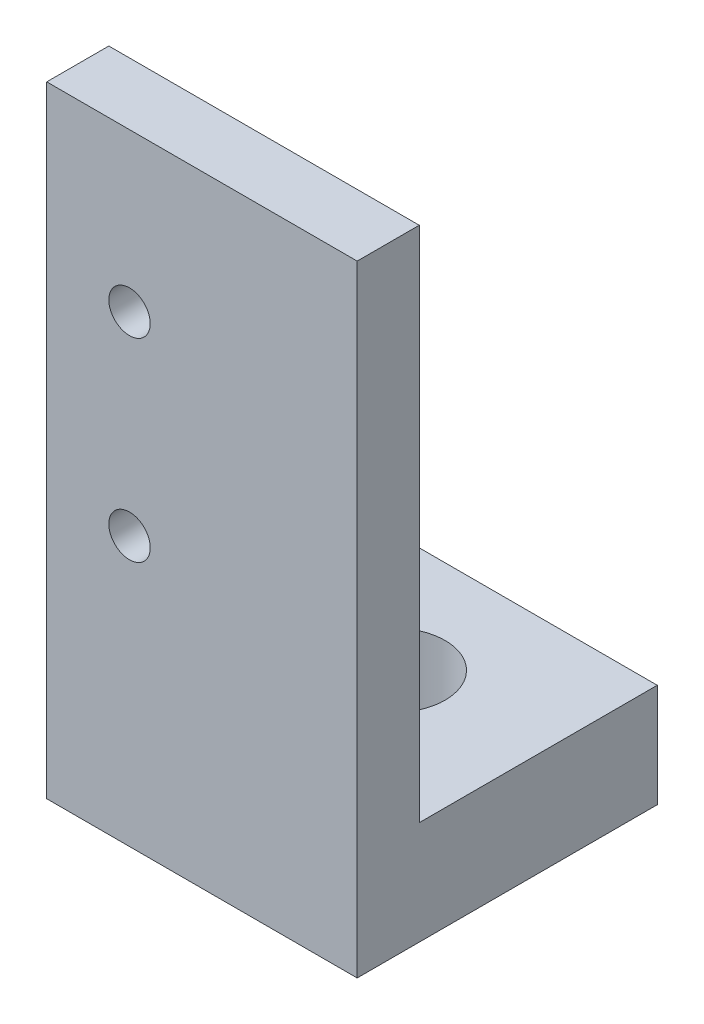
ISO-10303-21;
HEADER;
FILE_DESCRIPTION(('STEP AP214'),'2;1');
FILE_NAME('part.step','',(''),(''),'','','');
FILE_SCHEMA(('AUTOMOTIVE_DESIGN { 1 0 10303 214 1 1 1 1 }'));
ENDSEC;
DATA;
#1=APPLICATION_CONTEXT('core data for automotive mechanical design processes');
#2=APPLICATION_PROTOCOL_DEFINITION('international standard','automotive_design',2000,#1);
#3=PRODUCT_CONTEXT('',#1,'mechanical');
#4=PRODUCT('Part','Part','',(#3));
#5=PRODUCT_RELATED_PRODUCT_CATEGORY('part','',(#4));
#6=PRODUCT_DEFINITION_FORMATION('','',#4);
#7=PRODUCT_DEFINITION_CONTEXT('part definition',#1,'design');
#8=PRODUCT_DEFINITION('design','',#6,#7);
#9=PRODUCT_DEFINITION_SHAPE('','',#8);
#10=(LENGTH_UNIT() NAMED_UNIT(*) SI_UNIT(.MILLI.,.METRE.));
#11=(NAMED_UNIT(*) PLANE_ANGLE_UNIT() SI_UNIT($,.RADIAN.));
#12=(NAMED_UNIT(*) SI_UNIT($,.STERADIAN.) SOLID_ANGLE_UNIT());
#13=UNCERTAINTY_MEASURE_WITH_UNIT(LENGTH_MEASURE(1.E-05),#10,'distance_accuracy_value','');
#14=(GEOMETRIC_REPRESENTATION_CONTEXT(3) GLOBAL_UNCERTAINTY_ASSIGNED_CONTEXT((#13)) GLOBAL_UNIT_ASSIGNED_CONTEXT((#10,
#11,#12)) REPRESENTATION_CONTEXT('',''));
#15=CARTESIAN_POINT('',(0.,0.,0.));
#16=DIRECTION('',(0.,0.,1.));
#17=DIRECTION('',(1.,0.,0.));
#18=AXIS2_PLACEMENT_3D('',#15,#16,#17);
#19=CARTESIAN_POINT('',(0.,5.,-5.75));
#20=DIRECTION('',(0.,0.,-1.));
#21=DIRECTION('',(-1.,0.,0.));
#22=AXIS2_PLACEMENT_3D('',#19,#20,#21);
#23=PLANE('',#22);
#24=DIRECTION('',(0.,1.,0.));
#25=VECTOR('',#24,1.);
#26=CARTESIAN_POINT('',(7.00000000000001,5.,-5.75));
#27=LINE('',#26,#25);
#28=CARTESIAN_POINT('',(7.00000000000001,0.,-5.75));
#29=VERTEX_POINT('',#28);
#30=CARTESIAN_POINT('',(7.00000000000001,5.,-5.75));
#31=VERTEX_POINT('',#30);
#32=EDGE_CURVE('E264',#29,#31,#27,.T.);
#33=ORIENTED_EDGE('',*,*,#32,.F.);
#34=DIRECTION('',(1.,0.,0.));
#35=VECTOR('',#34,1.);
#36=CARTESIAN_POINT('',(0.,0.,-5.75));
#37=LINE('',#36,#35);
#38=CARTESIAN_POINT('',(-8.,0.,-5.75));
#39=VERTEX_POINT('',#38);
#40=EDGE_CURVE('E133',#39,#29,#37,.T.);
#41=ORIENTED_EDGE('',*,*,#40,.F.);
#42=DIRECTION('',(0.,-1.,0.));
#43=VECTOR('',#42,1.);
#44=CARTESIAN_POINT('',(-8.,5.,-5.75));
#45=LINE('',#44,#43);
#46=CARTESIAN_POINT('',(-8.,5.,-5.75));
#47=VERTEX_POINT('',#46);
#48=EDGE_CURVE('E43',#47,#39,#45,.T.);
#49=ORIENTED_EDGE('',*,*,#48,.F.);
#50=DIRECTION('',(1.,0.,0.));
#51=VECTOR('',#50,1.);
#52=CARTESIAN_POINT('',(0.,5.,-5.75));
#53=LINE('',#52,#51);
#54=EDGE_CURVE('E126',#47,#31,#53,.T.);
#55=ORIENTED_EDGE('',*,*,#54,.T.);
#56=EDGE_LOOP('',(#33,#41,#49,#55));
#57=FACE_BOUND('',#56,.T.);
#58=ADVANCED_FACE('F35',(#57),#23,.T.);
#59=CARTESIAN_POINT('',(-8.,5.,0.));
#60=DIRECTION('',(1.,0.,0.));
#61=DIRECTION('',(0.,0.,-1.));
#62=AXIS2_PLACEMENT_3D('',#59,#60,#61);
#63=PLANE('',#62);
#64=DIRECTION('',(0.,0.,1.));
#65=VECTOR('',#64,1.);
#66=CARTESIAN_POINT('',(-8.,0.,0.));
#67=LINE('',#66,#65);
#68=CARTESIAN_POINT('',(-8.,0.,8.75));
#69=VERTEX_POINT('',#68);
#70=EDGE_CURVE('E136',#39,#69,#67,.T.);
#71=ORIENTED_EDGE('',*,*,#70,.T.);
#72=DIRECTION('',(0.,-1.,0.));
#73=VECTOR('',#72,1.);
#74=CARTESIAN_POINT('',(-8.,5.,8.75));
#75=LINE('',#74,#73);
#76=CARTESIAN_POINT('',(-8.,30.,8.75));
#77=VERTEX_POINT('',#76);
#78=EDGE_CURVE('E73',#77,#69,#75,.T.);
#79=ORIENTED_EDGE('',*,*,#78,.F.);
#80=DIRECTION('',(0.,0.,1.));
#81=VECTOR('',#80,1.);
#82=CARTESIAN_POINT('',(-8.,30.,8.75));
#83=LINE('',#82,#81);
#84=CARTESIAN_POINT('',(-8.,30.,5.75));
#85=VERTEX_POINT('',#84);
#86=EDGE_CURVE('E106',#85,#77,#83,.T.);
#87=ORIENTED_EDGE('',*,*,#86,.F.);
#88=DIRECTION('',(0.,-1.,0.));
#89=VECTOR('',#88,1.);
#90=CARTESIAN_POINT('',(-8.,30.,5.75));
#91=LINE('',#90,#89);
#92=CARTESIAN_POINT('',(-8.,5.,5.75));
#93=VERTEX_POINT('',#92);
#94=EDGE_CURVE('E118',#85,#93,#91,.T.);
#95=ORIENTED_EDGE('',*,*,#94,.T.);
#96=DIRECTION('',(0.,0.,1.));
#97=VECTOR('',#96,1.);
#98=CARTESIAN_POINT('',(-8.,5.,0.));
#99=LINE('',#98,#97);
#100=EDGE_CURVE('E128',#47,#93,#99,.T.);
#101=ORIENTED_EDGE('',*,*,#100,.F.);
#102=ORIENTED_EDGE('',*,*,#48,.T.);
#103=EDGE_LOOP('',(#71,#79,#87,#95,#101,#102));
#104=FACE_BOUND('',#103,.T.);
#105=ADVANCED_FACE('F164',(#104),#63,.F.);
#106=CARTESIAN_POINT('',(0.,5.,0.));
#107=DIRECTION('',(0.,-1.,0.));
#108=DIRECTION('',(0.,0.,-1.));
#109=AXIS2_PLACEMENT_3D('',#106,#107,#108);
#110=CYLINDRICAL_SURFACE('',#109,2.5);
#111=CARTESIAN_POINT('',(0.,5.,0.));
#112=DIRECTION('',(0.,1.,0.));
#113=DIRECTION('',(0.,0.,1.));
#114=AXIS2_PLACEMENT_3D('',#111,#112,#113);
#115=CIRCLE('',#114,2.5);
#116=CARTESIAN_POINT('',(0.,5.,2.5));
#117=VERTEX_POINT('',#116);
#118=EDGE_CURVE('E123',#117,#117,#115,.T.);
#119=ORIENTED_EDGE('',*,*,#118,.T.);
#120=EDGE_LOOP('',(#119));
#121=FACE_BOUND('',#120,.T.);
#122=CARTESIAN_POINT('',(0.,0.,0.));
#123=DIRECTION('',(0.,1.,0.));
#124=DIRECTION('',(0.,0.,1.));
#125=AXIS2_PLACEMENT_3D('',#122,#123,#124);
#126=CIRCLE('',#125,2.5);
#127=CARTESIAN_POINT('',(0.,0.,2.5));
#128=VERTEX_POINT('',#127);
#129=EDGE_CURVE('E122',#128,#128,#126,.T.);
#130=ORIENTED_EDGE('',*,*,#129,.F.);
#131=EDGE_LOOP('',(#130));
#132=FACE_BOUND('',#131,.T.);
#133=ADVANCED_FACE('F37',(#121,#132),#110,.F.);
#134=CARTESIAN_POINT('',(0.,5.,8.75));
#135=DIRECTION('',(0.,0.,-1.));
#136=DIRECTION('',(-1.,0.,0.));
#137=AXIS2_PLACEMENT_3D('',#134,#135,#136);
#138=PLANE('',#137);
#139=CARTESIAN_POINT('',(-4.,22.38,8.75));
#140=DIRECTION('',(0.,0.,1.));
#141=DIRECTION('',(1.,0.,0.));
#142=AXIS2_PLACEMENT_3D('',#139,#140,#141);
#143=CIRCLE('',#142,1.);
#144=CARTESIAN_POINT('',(-3.,22.38,8.75));
#145=VERTEX_POINT('',#144);
#146=EDGE_CURVE('E143',#145,#145,#143,.T.);
#147=ORIENTED_EDGE('',*,*,#146,.F.);
#148=EDGE_LOOP('',(#147));
#149=FACE_BOUND('',#148,.T.);
#150=CARTESIAN_POINT('',(-4.,13.,8.75));
#151=DIRECTION('',(0.,0.,1.));
#152=DIRECTION('',(1.,0.,0.));
#153=AXIS2_PLACEMENT_3D('',#150,#151,#152);
#154=CIRCLE('',#153,1.);
#155=CARTESIAN_POINT('',(-3.,13.,8.75));
#156=VERTEX_POINT('',#155);
#157=EDGE_CURVE('E115',#156,#156,#154,.T.);
#158=ORIENTED_EDGE('',*,*,#157,.F.);
#159=EDGE_LOOP('',(#158));
#160=FACE_BOUND('',#159,.T.);
#161=DIRECTION('',(1.,0.,0.));
#162=VECTOR('',#161,1.);
#163=CARTESIAN_POINT('',(0.,0.,8.75));
#164=LINE('',#163,#162);
#165=CARTESIAN_POINT('',(7.00000000000001,0.,8.75));
#166=VERTEX_POINT('',#165);
#167=EDGE_CURVE('E102',#69,#166,#164,.T.);
#168=ORIENTED_EDGE('',*,*,#167,.T.);
#169=DIRECTION('',(0.,-1.,0.));
#170=VECTOR('',#169,1.);
#171=CARTESIAN_POINT('',(7.,30.,8.75));
#172=LINE('',#171,#170);
#173=CARTESIAN_POINT('',(7.,30.,8.75));
#174=VERTEX_POINT('',#173);
#175=EDGE_CURVE('E92',#174,#166,#172,.T.);
#176=ORIENTED_EDGE('',*,*,#175,.F.);
#177=DIRECTION('',(1.,0.,0.));
#178=VECTOR('',#177,1.);
#179=CARTESIAN_POINT('',(8.,30.,8.75));
#180=LINE('',#179,#178);
#181=EDGE_CURVE('E101',#77,#174,#180,.T.);
#182=ORIENTED_EDGE('',*,*,#181,.F.);
#183=ORIENTED_EDGE('',*,*,#78,.T.);
#184=EDGE_LOOP('',(#168,#176,#182,#183));
#185=FACE_BOUND('',#184,.T.);
#186=ADVANCED_FACE('F100',(#149,#160,#185),#138,.F.);
#187=CARTESIAN_POINT('',(0.,5.,0.));
#188=DIRECTION('',(0.,1.,0.));
#189=DIRECTION('',(0.,0.,1.));
#190=AXIS2_PLACEMENT_3D('',#187,#188,#189);
#191=PLANE('',#190);
#192=DIRECTION('',(0.,0.,1.));
#193=VECTOR('',#192,1.);
#194=CARTESIAN_POINT('',(7.00000000000001,5.,0.));
#195=LINE('',#194,#193);
#196=CARTESIAN_POINT('',(7.00000000000001,5.,5.75));
#197=VERTEX_POINT('',#196);
#198=EDGE_CURVE('E267',#31,#197,#195,.T.);
#199=ORIENTED_EDGE('',*,*,#198,.F.);
#200=ORIENTED_EDGE('',*,*,#54,.F.);
#201=ORIENTED_EDGE('',*,*,#100,.T.);
#202=DIRECTION('',(-1.,0.,0.));
#203=VECTOR('',#202,1.);
#204=CARTESIAN_POINT('',(-8.,5.,5.75));
#205=LINE('',#204,#203);
#206=EDGE_CURVE('E108',#197,#93,#205,.T.);
#207=ORIENTED_EDGE('',*,*,#206,.F.);
#208=EDGE_LOOP('',(#199,#200,#201,#207));
#209=FACE_BOUND('',#208,.T.);
#210=ORIENTED_EDGE('',*,*,#118,.F.);
#211=EDGE_LOOP('',(#210));
#212=FACE_BOUND('',#211,.T.);
#213=ADVANCED_FACE('F173',(#209,#212),#191,.T.);
#214=CARTESIAN_POINT('',(0.,0.,0.));
#215=DIRECTION('',(0.,1.,0.));
#216=DIRECTION('',(0.,0.,1.));
#217=AXIS2_PLACEMENT_3D('',#214,#215,#216);
#218=PLANE('',#217);
#219=ORIENTED_EDGE('',*,*,#129,.T.);
#220=EDGE_LOOP('',(#219));
#221=FACE_BOUND('',#220,.T.);
#222=ORIENTED_EDGE('',*,*,#40,.T.);
#223=DIRECTION('',(0.,0.,1.));
#224=VECTOR('',#223,1.);
#225=CARTESIAN_POINT('',(7.00000000000001,0.,-16.25));
#226=LINE('',#225,#224);
#227=EDGE_CURVE('E103',#29,#166,#226,.T.);
#228=ORIENTED_EDGE('',*,*,#227,.T.);
#229=ORIENTED_EDGE('',*,*,#167,.F.);
#230=ORIENTED_EDGE('',*,*,#70,.F.);
#231=EDGE_LOOP('',(#222,#228,#229,#230));
#232=FACE_BOUND('',#231,.T.);
#233=ADVANCED_FACE('F175',(#221,#232),#218,.F.);
#234=CARTESIAN_POINT('',(-8.,30.,5.75));
#235=DIRECTION('',(0.,0.,1.));
#236=DIRECTION('',(1.,0.,0.));
#237=AXIS2_PLACEMENT_3D('',#234,#235,#236);
#238=PLANE('',#237);
#239=CARTESIAN_POINT('',(-4.,22.38,5.75));
#240=DIRECTION('',(0.,0.,1.));
#241=DIRECTION('',(1.,0.,0.));
#242=AXIS2_PLACEMENT_3D('',#239,#240,#241);
#243=CIRCLE('',#242,1.);
#244=CARTESIAN_POINT('',(-3.,22.38,5.75));
#245=VERTEX_POINT('',#244);
#246=EDGE_CURVE('E112',#245,#245,#243,.T.);
#247=ORIENTED_EDGE('',*,*,#246,.T.);
#248=EDGE_LOOP('',(#247));
#249=FACE_BOUND('',#248,.T.);
#250=CARTESIAN_POINT('',(-4.,13.,5.75));
#251=DIRECTION('',(0.,0.,1.));
#252=DIRECTION('',(1.,0.,0.));
#253=AXIS2_PLACEMENT_3D('',#250,#251,#252);
#254=CIRCLE('',#253,1.);
#255=CARTESIAN_POINT('',(-3.,13.,5.75));
#256=VERTEX_POINT('',#255);
#257=EDGE_CURVE('E141',#256,#256,#254,.T.);
#258=ORIENTED_EDGE('',*,*,#257,.T.);
#259=EDGE_LOOP('',(#258));
#260=FACE_BOUND('',#259,.T.);
#261=DIRECTION('',(-1.,0.,0.));
#262=VECTOR('',#261,1.);
#263=CARTESIAN_POINT('',(-8.,30.,5.75));
#264=LINE('',#263,#262);
#265=CARTESIAN_POINT('',(7.,30.,5.75));
#266=VERTEX_POINT('',#265);
#267=EDGE_CURVE('E107',#266,#85,#264,.T.);
#268=ORIENTED_EDGE('',*,*,#267,.F.);
#269=DIRECTION('',(0.,-1.,0.));
#270=VECTOR('',#269,1.);
#271=CARTESIAN_POINT('',(7.,30.,5.75));
#272=LINE('',#271,#270);
#273=EDGE_CURVE('E50',#266,#197,#272,.T.);
#274=ORIENTED_EDGE('',*,*,#273,.T.);
#275=ORIENTED_EDGE('',*,*,#206,.T.);
#276=ORIENTED_EDGE('',*,*,#94,.F.);
#277=EDGE_LOOP('',(#268,#274,#275,#276));
#278=FACE_BOUND('',#277,.T.);
#279=ADVANCED_FACE('F147',(#249,#260,#278),#238,.F.);
#280=CARTESIAN_POINT('',(0.,30.,0.));
#281=DIRECTION('',(0.,-1.,0.));
#282=DIRECTION('',(0.,0.,-1.));
#283=AXIS2_PLACEMENT_3D('',#280,#281,#282);
#284=PLANE('',#283);
#285=ORIENTED_EDGE('',*,*,#181,.T.);
#286=DIRECTION('',(0.,0.,-1.));
#287=VECTOR('',#286,1.);
#288=CARTESIAN_POINT('',(7.,30.,0.));
#289=LINE('',#288,#287);
#290=EDGE_CURVE('E11',#174,#266,#289,.T.);
#291=ORIENTED_EDGE('',*,*,#290,.T.);
#292=ORIENTED_EDGE('',*,*,#267,.T.);
#293=ORIENTED_EDGE('',*,*,#86,.T.);
#294=EDGE_LOOP('',(#285,#291,#292,#293));
#295=FACE_BOUND('',#294,.T.);
#296=ADVANCED_FACE('F105',(#295),#284,.F.);
#297=CARTESIAN_POINT('',(-4.,13.,-16.25));
#298=DIRECTION('',(0.,0.,1.));
#299=DIRECTION('',(1.,0.,0.));
#300=AXIS2_PLACEMENT_3D('',#297,#298,#299);
#301=CYLINDRICAL_SURFACE('',#300,1.);
#302=ORIENTED_EDGE('',*,*,#157,.T.);
#303=EDGE_LOOP('',(#302));
#304=FACE_BOUND('',#303,.T.);
#305=ORIENTED_EDGE('',*,*,#257,.F.);
#306=EDGE_LOOP('',(#305));
#307=FACE_BOUND('',#306,.T.);
#308=ADVANCED_FACE('F152',(#304,#307),#301,.F.);
#309=CARTESIAN_POINT('',(-4.,22.38,-16.25));
#310=DIRECTION('',(0.,0.,1.));
#311=DIRECTION('',(1.,0.,0.));
#312=AXIS2_PLACEMENT_3D('',#309,#310,#311);
#313=CYLINDRICAL_SURFACE('',#312,1.);
#314=ORIENTED_EDGE('',*,*,#146,.T.);
#315=EDGE_LOOP('',(#314));
#316=FACE_BOUND('',#315,.T.);
#317=ORIENTED_EDGE('',*,*,#246,.F.);
#318=EDGE_LOOP('',(#317));
#319=FACE_BOUND('',#318,.T.);
#320=ADVANCED_FACE('F150',(#316,#319),#313,.F.);
#321=CARTESIAN_POINT('',(7.,30.,-16.25));
#322=DIRECTION('',(-1.,0.,0.));
#323=DIRECTION('',(0.,-1.,0.));
#324=AXIS2_PLACEMENT_3D('',#321,#322,#323);
#325=PLANE('',#324);
#326=ORIENTED_EDGE('',*,*,#32,.T.);
#327=ORIENTED_EDGE('',*,*,#198,.T.);
#328=ORIENTED_EDGE('',*,*,#273,.F.);
#329=ORIENTED_EDGE('',*,*,#290,.F.);
#330=ORIENTED_EDGE('',*,*,#175,.T.);
#331=ORIENTED_EDGE('',*,*,#227,.F.);
#332=EDGE_LOOP('',(#326,#327,#328,#329,#330,#331));
#333=FACE_BOUND('',#332,.T.);
#334=ADVANCED_FACE('F91',(#333),#325,.F.);
#335=CLOSED_SHELL('',(#58,#105,#133,#186,#213,#233,#279,#296,#308,#320,#334));
#336=MANIFOLD_SOLID_BREP('B2',#335);
#337=ADVANCED_BREP_SHAPE_REPRESENTATION('',(#18,#336),#14);
#338=SHAPE_DEFINITION_REPRESENTATION(#9,#337);
ENDSEC;
END-ISO-10303-21;
